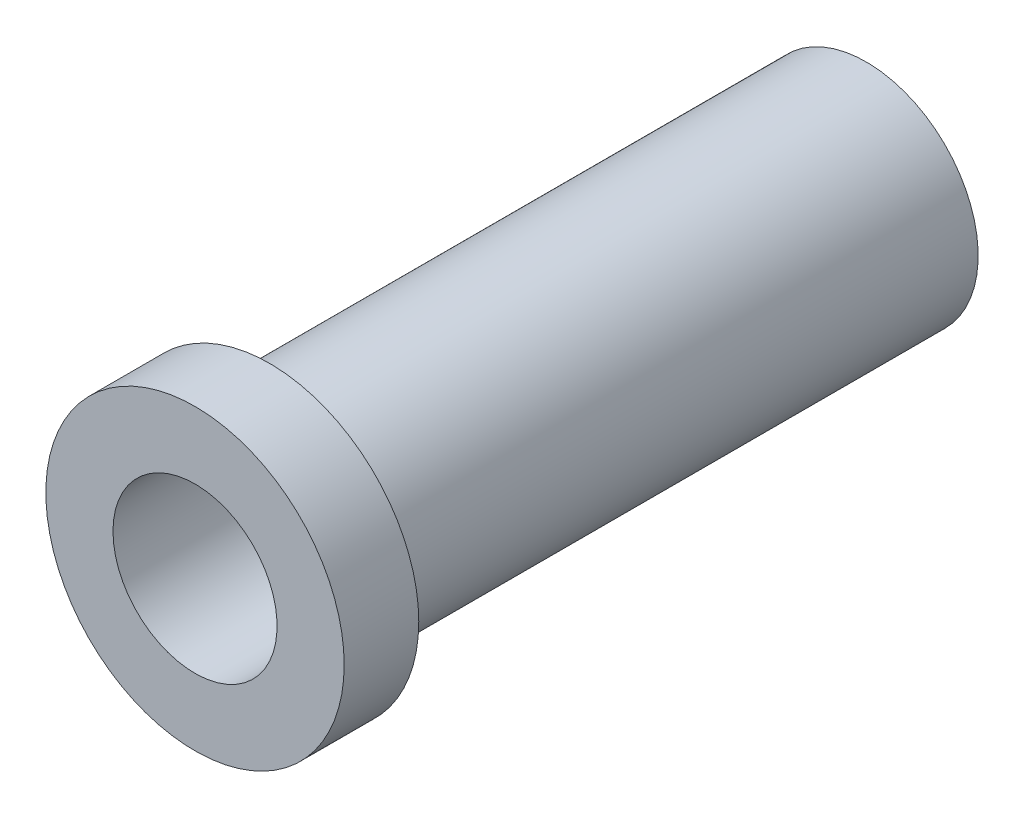
ISO-10303-21;
HEADER;
FILE_DESCRIPTION(('STEP AP214'),'2;1');
FILE_NAME('part.step','',(''),(''),'','','');
FILE_SCHEMA(('AUTOMOTIVE_DESIGN { 1 0 10303 214 1 1 1 1 }'));
ENDSEC;
DATA;
#1=APPLICATION_CONTEXT('core data for automotive mechanical design processes');
#2=APPLICATION_PROTOCOL_DEFINITION('international standard','automotive_design',2000,#1);
#3=PRODUCT_CONTEXT('',#1,'mechanical');
#4=PRODUCT('Part','Part','',(#3));
#5=PRODUCT_RELATED_PRODUCT_CATEGORY('part','',(#4));
#6=PRODUCT_DEFINITION_FORMATION('','',#4);
#7=PRODUCT_DEFINITION_CONTEXT('part definition',#1,'design');
#8=PRODUCT_DEFINITION('design','',#6,#7);
#9=PRODUCT_DEFINITION_SHAPE('','',#8);
#10=(LENGTH_UNIT() NAMED_UNIT(*) SI_UNIT(.MILLI.,.METRE.));
#11=(NAMED_UNIT(*) PLANE_ANGLE_UNIT() SI_UNIT($,.RADIAN.));
#12=(NAMED_UNIT(*) SI_UNIT($,.STERADIAN.) SOLID_ANGLE_UNIT());
#13=UNCERTAINTY_MEASURE_WITH_UNIT(LENGTH_MEASURE(1.E-05),#10,'distance_accuracy_value','');
#14=(GEOMETRIC_REPRESENTATION_CONTEXT(3) GLOBAL_UNCERTAINTY_ASSIGNED_CONTEXT((#13)) GLOBAL_UNIT_ASSIGNED_CONTEXT((#10,
#11,#12)) REPRESENTATION_CONTEXT('',''));
#15=CARTESIAN_POINT('',(0.,0.,0.));
#16=DIRECTION('',(0.,0.,1.));
#17=DIRECTION('',(1.,0.,0.));
#18=AXIS2_PLACEMENT_3D('',#15,#16,#17);
#19=CARTESIAN_POINT('',(0.,0.,5.));
#20=DIRECTION('',(0.,0.,-1.));
#21=DIRECTION('',(-1.,0.,0.));
#22=AXIS2_PLACEMENT_3D('',#19,#20,#21);
#23=CYLINDRICAL_SURFACE('',#22,10.);
#24=CARTESIAN_POINT('',(0.,0.,5.));
#25=DIRECTION('',(0.,0.,1.));
#26=DIRECTION('',(1.,0.,0.));
#27=AXIS2_PLACEMENT_3D('',#24,#25,#26);
#28=CIRCLE('',#27,10.);
#29=CARTESIAN_POINT('',(10.,0.,5.));
#30=VERTEX_POINT('',#29);
#31=EDGE_CURVE('E47',#30,#30,#28,.T.);
#32=ORIENTED_EDGE('',*,*,#31,.F.);
#33=EDGE_LOOP('',(#32));
#34=FACE_BOUND('',#33,.T.);
#35=CARTESIAN_POINT('',(0.,0.,0.));
#36=DIRECTION('',(0.,0.,1.));
#37=DIRECTION('',(1.,0.,0.));
#38=AXIS2_PLACEMENT_3D('',#35,#36,#37);
#39=CIRCLE('',#38,10.);
#40=CARTESIAN_POINT('',(10.,0.,0.));
#41=VERTEX_POINT('',#40);
#42=EDGE_CURVE('E42',#41,#41,#39,.T.);
#43=ORIENTED_EDGE('',*,*,#42,.T.);
#44=EDGE_LOOP('',(#43));
#45=FACE_BOUND('',#44,.T.);
#46=ADVANCED_FACE('F39',(#34,#45),#23,.T.);
#47=CARTESIAN_POINT('',(0.,0.,5.));
#48=DIRECTION('',(0.,0.,1.));
#49=DIRECTION('',(1.,0.,0.));
#50=AXIS2_PLACEMENT_3D('',#47,#48,#49);
#51=PLANE('',#50);
#52=CARTESIAN_POINT('',(0.,0.,5.));
#53=DIRECTION('',(0.,0.,-1.));
#54=DIRECTION('',(-1.,0.,0.));
#55=AXIS2_PLACEMENT_3D('',#52,#53,#54);
#56=CIRCLE('',#55,5.5);
#57=CARTESIAN_POINT('',(-5.5,0.,5.));
#58=VERTEX_POINT('',#57);
#59=EDGE_CURVE('E58',#58,#58,#56,.T.);
#60=ORIENTED_EDGE('',*,*,#59,.T.);
#61=EDGE_LOOP('',(#60));
#62=FACE_BOUND('',#61,.T.);
#63=ORIENTED_EDGE('',*,*,#31,.T.);
#64=EDGE_LOOP('',(#63));
#65=FACE_BOUND('',#64,.T.);
#66=ADVANCED_FACE('F67',(#62,#65),#51,.T.);
#67=CARTESIAN_POINT('',(0.,0.,0.));
#68=DIRECTION('',(0.,0.,1.));
#69=DIRECTION('',(1.,0.,0.));
#70=AXIS2_PLACEMENT_3D('',#67,#68,#69);
#71=PLANE('',#70);
#72=CARTESIAN_POINT('',(0.,0.,0.));
#73=DIRECTION('',(0.,0.,-1.));
#74=DIRECTION('',(-1.,0.,0.));
#75=AXIS2_PLACEMENT_3D('',#72,#73,#74);
#76=CIRCLE('',#75,7.5);
#77=CARTESIAN_POINT('',(-7.5,0.,0.));
#78=VERTEX_POINT('',#77);
#79=EDGE_CURVE('E10',#78,#78,#76,.T.);
#80=ORIENTED_EDGE('',*,*,#79,.F.);
#81=EDGE_LOOP('',(#80));
#82=FACE_BOUND('',#81,.T.);
#83=ORIENTED_EDGE('',*,*,#42,.F.);
#84=EDGE_LOOP('',(#83));
#85=FACE_BOUND('',#84,.T.);
#86=ADVANCED_FACE('F84',(#82,#85),#71,.F.);
#87=CARTESIAN_POINT('',(0.,0.,-40.));
#88=DIRECTION('',(0.,0.,1.));
#89=DIRECTION('',(1.,0.,0.));
#90=AXIS2_PLACEMENT_3D('',#87,#88,#89);
#91=CYLINDRICAL_SURFACE('',#90,7.5);
#92=CARTESIAN_POINT('',(0.,0.,-40.));
#93=DIRECTION('',(0.,0.,-1.));
#94=DIRECTION('',(-1.,0.,0.));
#95=AXIS2_PLACEMENT_3D('',#92,#93,#94);
#96=CIRCLE('',#95,7.5);
#97=CARTESIAN_POINT('',(-7.5,0.,-40.));
#98=VERTEX_POINT('',#97);
#99=EDGE_CURVE('E54',#98,#98,#96,.T.);
#100=ORIENTED_EDGE('',*,*,#99,.F.);
#101=EDGE_LOOP('',(#100));
#102=FACE_BOUND('',#101,.T.);
#103=ORIENTED_EDGE('',*,*,#79,.T.);
#104=EDGE_LOOP('',(#103));
#105=FACE_BOUND('',#104,.T.);
#106=ADVANCED_FACE('F79',(#102,#105),#91,.T.);
#107=CARTESIAN_POINT('',(0.,0.,-40.));
#108=DIRECTION('',(0.,0.,-1.));
#109=DIRECTION('',(-1.,0.,0.));
#110=AXIS2_PLACEMENT_3D('',#107,#108,#109);
#111=PLANE('',#110);
#112=CARTESIAN_POINT('',(0.,0.,-40.));
#113=DIRECTION('',(0.,0.,-1.));
#114=DIRECTION('',(-1.,0.,0.));
#115=AXIS2_PLACEMENT_3D('',#112,#113,#114);
#116=CIRCLE('',#115,5.5);
#117=CARTESIAN_POINT('',(-5.5,0.,-40.));
#118=VERTEX_POINT('',#117);
#119=EDGE_CURVE('E59',#118,#118,#116,.T.);
#120=ORIENTED_EDGE('',*,*,#119,.F.);
#121=EDGE_LOOP('',(#120));
#122=FACE_BOUND('',#121,.T.);
#123=ORIENTED_EDGE('',*,*,#99,.T.);
#124=EDGE_LOOP('',(#123));
#125=FACE_BOUND('',#124,.T.);
#126=ADVANCED_FACE('F73',(#122,#125),#111,.T.);
#127=CARTESIAN_POINT('',(0.,0.,5.));
#128=DIRECTION('',(0.,0.,-1.));
#129=DIRECTION('',(-1.,0.,0.));
#130=AXIS2_PLACEMENT_3D('',#127,#128,#129);
#131=CYLINDRICAL_SURFACE('',#130,5.5);
#132=CARTESIAN_POINT('',(-5.5,0.,5.));
#133=CARTESIAN_POINT('',(-5.5,0.,4.53125));
#134=CARTESIAN_POINT('',(-5.5,0.,4.0625));
#135=CARTESIAN_POINT('',(-5.5,0.,3.125));
#136=CARTESIAN_POINT('',(-5.5,0.,2.65625));
#137=CARTESIAN_POINT('',(-5.5,0.,1.71875));
#138=CARTESIAN_POINT('',(-5.5,0.,1.25));
#139=CARTESIAN_POINT('',(-5.5,0.,0.312499999999999));
#140=CARTESIAN_POINT('',(-5.5,0.,-0.156250000000001));
#141=CARTESIAN_POINT('',(-5.5,0.,-1.09375));
#142=CARTESIAN_POINT('',(-5.5,0.,-1.5625));
#143=CARTESIAN_POINT('',(-5.5,0.,-2.5));
#144=CARTESIAN_POINT('',(-5.5,0.,-2.96875));
#145=CARTESIAN_POINT('',(-5.5,0.,-3.90625));
#146=CARTESIAN_POINT('',(-5.5,0.,-4.375));
#147=CARTESIAN_POINT('',(-5.5,0.,-5.3125));
#148=CARTESIAN_POINT('',(-5.5,0.,-5.78125));
#149=CARTESIAN_POINT('',(-5.5,0.,-6.71875));
#150=CARTESIAN_POINT('',(-5.5,0.,-7.1875));
#151=CARTESIAN_POINT('',(-5.5,0.,-8.125));
#152=CARTESIAN_POINT('',(-5.5,0.,-8.59375));
#153=CARTESIAN_POINT('',(-5.5,0.,-9.53125));
#154=CARTESIAN_POINT('',(-5.5,0.,-10.));
#155=CARTESIAN_POINT('',(-5.5,0.,-10.9375));
#156=CARTESIAN_POINT('',(-5.5,0.,-11.40625));
#157=CARTESIAN_POINT('',(-5.5,0.,-12.34375));
#158=CARTESIAN_POINT('',(-5.5,0.,-12.8125));
#159=CARTESIAN_POINT('',(-5.5,0.,-13.75));
#160=CARTESIAN_POINT('',(-5.5,0.,-14.21875));
#161=CARTESIAN_POINT('',(-5.5,0.,-15.15625));
#162=CARTESIAN_POINT('',(-5.5,0.,-15.625));
#163=CARTESIAN_POINT('',(-5.5,0.,-16.5625));
#164=CARTESIAN_POINT('',(-5.5,0.,-17.03125));
#165=CARTESIAN_POINT('',(-5.5,0.,-17.96875));
#166=CARTESIAN_POINT('',(-5.5,0.,-18.4375));
#167=CARTESIAN_POINT('',(-5.5,0.,-19.375));
#168=CARTESIAN_POINT('',(-5.5,0.,-19.84375));
#169=CARTESIAN_POINT('',(-5.5,0.,-20.78125));
#170=CARTESIAN_POINT('',(-5.5,0.,-21.25));
#171=CARTESIAN_POINT('',(-5.5,0.,-22.1875));
#172=CARTESIAN_POINT('',(-5.5,0.,-22.65625));
#173=CARTESIAN_POINT('',(-5.5,0.,-23.59375));
#174=CARTESIAN_POINT('',(-5.5,0.,-24.0625));
#175=CARTESIAN_POINT('',(-5.5,0.,-25.));
#176=CARTESIAN_POINT('',(-5.5,0.,-25.46875));
#177=CARTESIAN_POINT('',(-5.5,0.,-26.40625));
#178=CARTESIAN_POINT('',(-5.5,0.,-26.875));
#179=CARTESIAN_POINT('',(-5.5,0.,-27.8125));
#180=CARTESIAN_POINT('',(-5.5,0.,-28.28125));
#181=CARTESIAN_POINT('',(-5.5,0.,-29.21875));
#182=CARTESIAN_POINT('',(-5.5,0.,-29.6875));
#183=CARTESIAN_POINT('',(-5.5,0.,-30.625));
#184=CARTESIAN_POINT('',(-5.5,0.,-31.09375));
#185=CARTESIAN_POINT('',(-5.5,0.,-32.03125));
#186=CARTESIAN_POINT('',(-5.5,0.,-32.5));
#187=CARTESIAN_POINT('',(-5.5,0.,-33.4375));
#188=CARTESIAN_POINT('',(-5.5,0.,-33.90625));
#189=CARTESIAN_POINT('',(-5.5,0.,-34.84375));
#190=CARTESIAN_POINT('',(-5.5,0.,-35.3125));
#191=CARTESIAN_POINT('',(-5.5,0.,-36.25));
#192=CARTESIAN_POINT('',(-5.5,0.,-36.71875));
#193=CARTESIAN_POINT('',(-5.5,0.,-37.65625));
#194=CARTESIAN_POINT('',(-5.5,0.,-38.125));
#195=CARTESIAN_POINT('',(-5.5,0.,-39.0625));
#196=CARTESIAN_POINT('',(-5.5,0.,-39.53125));
#197=CARTESIAN_POINT('',(-5.5,0.,-40.));
#198=B_SPLINE_CURVE_WITH_KNOTS('',3,(#132,#133,#134,#135,#136,#137,#138,#139,#140,#141,#142,
#143,#144,#145,#146,#147,#148,#149,#150,#151,#152,#153,#154,#155,#156,#157,#158,#159,#160,#161,
#162,#163,#164,#165,#166,#167,#168,#169,#170,#171,#172,#173,#174,#175,#176,#177,#178,#179,#180,
#181,#182,#183,#184,#185,#186,#187,#188,#189,#190,#191,#192,#193,#194,#195,#196,#197),
.UNSPECIFIED.,.F.,.F.,(4,2,2,2,2,2,2,2,2,2,2,2,2,2,2,2,2,2,2,2,2,2,2,2,2,2,2,2,2,2,2,2,4),(0.,
1.40625,2.8125,4.21875,5.625,7.03125,8.4375,9.84375,11.25,12.65625,14.0625,15.46875,16.875,
18.28125,19.6875,21.09375,22.5,23.90625,25.3125,26.71875,28.125,29.53125,30.9375,32.34375,33.75,
35.15625,36.5625,37.96875,39.375,40.78125,42.1875,43.59375,45.),.UNSPECIFIED.);
#199=EDGE_CURVE('BSEAM70',#58,#118,#198,.T.);
#200=ORIENTED_EDGE('',*,*,#59,.F.);
#201=ORIENTED_EDGE('',*,*,#119,.T.);
#202=ORIENTED_EDGE('',*,*,#199,.T.);
#203=ORIENTED_EDGE('',*,*,#199,.F.);
#204=EDGE_LOOP('',(#200,#202,#201,#203));
#205=FACE_BOUND('',#204,.T.);
#206=ADVANCED_FACE('F70',(#205),#131,.F.);
#207=CLOSED_SHELL('',(#46,#66,#86,#106,#126,#206));
#208=MANIFOLD_SOLID_BREP('B2',#207);
#209=ADVANCED_BREP_SHAPE_REPRESENTATION('',(#18,#208),#14);
#210=SHAPE_DEFINITION_REPRESENTATION(#9,#209);
ENDSEC;
END-ISO-10303-21;
